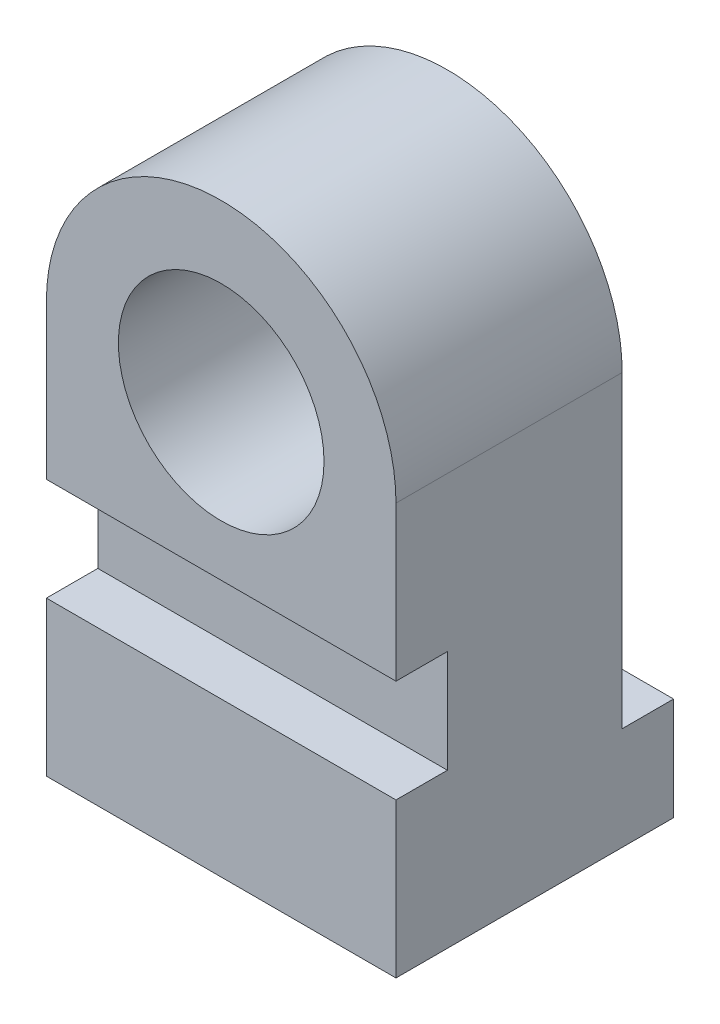
ISO-10303-21;
HEADER;
FILE_DESCRIPTION(('STEP AP214'),'2;1');
FILE_NAME('part.step','',(''),(''),'','','');
FILE_SCHEMA(('AUTOMOTIVE_DESIGN { 1 0 10303 214 1 1 1 1 }'));
ENDSEC;
DATA;
#1=APPLICATION_CONTEXT('core data for automotive mechanical design processes');
#2=APPLICATION_PROTOCOL_DEFINITION('international standard','automotive_design',2000,#1);
#3=PRODUCT_CONTEXT('',#1,'mechanical');
#4=PRODUCT('Part','Part','',(#3));
#5=PRODUCT_RELATED_PRODUCT_CATEGORY('part','',(#4));
#6=PRODUCT_DEFINITION_FORMATION('','',#4);
#7=PRODUCT_DEFINITION_CONTEXT('part definition',#1,'design');
#8=PRODUCT_DEFINITION('design','',#6,#7);
#9=PRODUCT_DEFINITION_SHAPE('','',#8);
#10=(LENGTH_UNIT() NAMED_UNIT(*) SI_UNIT(.MILLI.,.METRE.));
#11=(NAMED_UNIT(*) PLANE_ANGLE_UNIT() SI_UNIT($,.RADIAN.));
#12=(NAMED_UNIT(*) SI_UNIT($,.STERADIAN.) SOLID_ANGLE_UNIT());
#13=UNCERTAINTY_MEASURE_WITH_UNIT(LENGTH_MEASURE(1.E-05),#10,'distance_accuracy_value','');
#14=(GEOMETRIC_REPRESENTATION_CONTEXT(3) GLOBAL_UNCERTAINTY_ASSIGNED_CONTEXT((#13)) GLOBAL_UNIT_ASSIGNED_CONTEXT((#10,
#11,#12)) REPRESENTATION_CONTEXT('',''));
#15=CARTESIAN_POINT('',(0.,0.,0.));
#16=DIRECTION('',(0.,0.,1.));
#17=DIRECTION('',(1.,0.,0.));
#18=AXIS2_PLACEMENT_3D('',#15,#16,#17);
#19=CARTESIAN_POINT('',(0.,40000.,0.));
#20=DIRECTION('',(0.,0.,1.));
#21=DIRECTION('',(1.,0.,0.));
#22=AXIS2_PLACEMENT_3D('',#19,#20,#21);
#23=PLANE('',#22);
#24=CARTESIAN_POINT('',(0.,40000.,0.));
#25=DIRECTION('',(0.,0.,1.));
#26=DIRECTION('',(1.,0.,0.));
#27=AXIS2_PLACEMENT_3D('',#24,#25,#26);
#28=CIRCLE('',#27,10000.);
#29=CARTESIAN_POINT('',(10000.,40000.,0.));
#30=VERTEX_POINT('',#29);
#31=EDGE_CURVE('E160',#30,#30,#28,.T.);
#32=ORIENTED_EDGE('',*,*,#31,.T.);
#33=EDGE_LOOP('',(#32));
#34=FACE_BOUND('',#33,.T.);
#35=DIRECTION('',(1.,0.,0.));
#36=VECTOR('',#35,1.);
#37=CARTESIAN_POINT('',(17000.,10000.,0.));
#38=LINE('',#37,#36);
#39=CARTESIAN_POINT('',(-17000.,10000.,0.));
#40=VERTEX_POINT('',#39);
#41=CARTESIAN_POINT('',(17000.,10000.,0.));
#42=VERTEX_POINT('',#41);
#43=EDGE_CURVE('E47',#40,#42,#38,.T.);
#44=ORIENTED_EDGE('',*,*,#43,.F.);
#45=DIRECTION('',(0.,-1.,0.));
#46=VECTOR('',#45,1.);
#47=CARTESIAN_POINT('',(-17000.,40000.,0.));
#48=LINE('',#47,#46);
#49=CARTESIAN_POINT('',(-17000.,40000.,0.));
#50=VERTEX_POINT('',#49);
#51=EDGE_CURVE('E169',#50,#40,#48,.T.);
#52=ORIENTED_EDGE('',*,*,#51,.F.);
#53=CARTESIAN_POINT('',(0.,40000.,0.));
#54=DIRECTION('',(0.,0.,1.));
#55=DIRECTION('',(1.,0.,0.));
#56=AXIS2_PLACEMENT_3D('',#53,#54,#55);
#57=CIRCLE('',#56,17000.);
#58=CARTESIAN_POINT('',(17000.,40000.,0.));
#59=VERTEX_POINT('',#58);
#60=EDGE_CURVE('E186',#59,#50,#57,.T.);
#61=ORIENTED_EDGE('',*,*,#60,.F.);
#62=DIRECTION('',(0.,1.,0.));
#63=VECTOR('',#62,1.);
#64=CARTESIAN_POINT('',(17000.,40000.,0.));
#65=LINE('',#64,#63);
#66=EDGE_CURVE('E184',#42,#59,#65,.T.);
#67=ORIENTED_EDGE('',*,*,#66,.F.);
#68=EDGE_LOOP('',(#44,#52,#61,#67));
#69=FACE_BOUND('',#68,.T.);
#70=ADVANCED_FACE('F32',(#34,#69),#23,.F.);
#71=CARTESIAN_POINT('',(0.,40000.,22000.));
#72=DIRECTION('',(0.,0.,1.));
#73=DIRECTION('',(1.,0.,0.));
#74=AXIS2_PLACEMENT_3D('',#71,#72,#73);
#75=PLANE('',#74);
#76=DIRECTION('',(-1.,0.,0.));
#77=VECTOR('',#76,1.);
#78=CARTESIAN_POINT('',(-17000.,25000.,22000.));
#79=LINE('',#78,#77);
#80=CARTESIAN_POINT('',(17000.,25000.,22000.));
#81=VERTEX_POINT('',#80);
#82=CARTESIAN_POINT('',(-17000.,25000.,22000.));
#83=VERTEX_POINT('',#82);
#84=EDGE_CURVE('E147',#81,#83,#79,.T.);
#85=ORIENTED_EDGE('',*,*,#84,.F.);
#86=DIRECTION('',(0.,1.,0.));
#87=VECTOR('',#86,1.);
#88=CARTESIAN_POINT('',(17000.,40000.,22000.));
#89=LINE('',#88,#87);
#90=CARTESIAN_POINT('',(17000.,40000.,22000.));
#91=VERTEX_POINT('',#90);
#92=EDGE_CURVE('E178',#81,#91,#89,.T.);
#93=ORIENTED_EDGE('',*,*,#92,.T.);
#94=CARTESIAN_POINT('',(0.,40000.,22000.));
#95=DIRECTION('',(0.,0.,1.));
#96=DIRECTION('',(1.,0.,0.));
#97=AXIS2_PLACEMENT_3D('',#94,#95,#96);
#98=CIRCLE('',#97,17000.);
#99=CARTESIAN_POINT('',(-17000.,40000.,22000.));
#100=VERTEX_POINT('',#99);
#101=EDGE_CURVE('E180',#91,#100,#98,.T.);
#102=ORIENTED_EDGE('',*,*,#101,.T.);
#103=DIRECTION('',(0.,-1.,0.));
#104=VECTOR('',#103,1.);
#105=CARTESIAN_POINT('',(-17000.,40000.,22000.));
#106=LINE('',#105,#104);
#107=EDGE_CURVE('E172',#100,#83,#106,.T.);
#108=ORIENTED_EDGE('',*,*,#107,.T.);
#109=EDGE_LOOP('',(#85,#93,#102,#108));
#110=FACE_BOUND('',#109,.T.);
#111=CARTESIAN_POINT('',(0.,40000.,22000.));
#112=DIRECTION('',(0.,0.,1.));
#113=DIRECTION('',(1.,0.,0.));
#114=AXIS2_PLACEMENT_3D('',#111,#112,#113);
#115=CIRCLE('',#114,10000.);
#116=CARTESIAN_POINT('',(10000.,40000.,22000.));
#117=VERTEX_POINT('',#116);
#118=EDGE_CURVE('E166',#117,#117,#115,.T.);
#119=ORIENTED_EDGE('',*,*,#118,.F.);
#120=EDGE_LOOP('',(#119));
#121=FACE_BOUND('',#120,.T.);
#122=ADVANCED_FACE('F214',(#110,#121),#75,.T.);
#123=DIRECTION('',(1.,0.,0.));
#124=VECTOR('',#123,1.);
#125=CARTESIAN_POINT('',(-17000.,15000.,22000.));
#126=LINE('',#125,#124);
#127=CARTESIAN_POINT('',(-17000.,15000.,22000.));
#128=VERTEX_POINT('',#127);
#129=CARTESIAN_POINT('',(17000.,15000.,22000.));
#130=VERTEX_POINT('',#129);
#131=EDGE_CURVE('E144',#128,#130,#126,.T.);
#132=ORIENTED_EDGE('',*,*,#131,.F.);
#133=CARTESIAN_POINT('',(-17000.,0.,22000.));
#134=VERTEX_POINT('',#133);
#135=EDGE_CURVE('E176',#128,#134,#106,.T.);
#136=ORIENTED_EDGE('',*,*,#135,.T.);
#137=DIRECTION('',(1.,0.,0.));
#138=VECTOR('',#137,1.);
#139=CARTESIAN_POINT('',(-17000.,0.,22000.));
#140=LINE('',#139,#138);
#141=CARTESIAN_POINT('',(17000.,0.,22000.));
#142=VERTEX_POINT('',#141);
#143=EDGE_CURVE('E175',#134,#142,#140,.T.);
#144=ORIENTED_EDGE('',*,*,#143,.T.);
#145=EDGE_CURVE('E118',#142,#130,#89,.T.);
#146=ORIENTED_EDGE('',*,*,#145,.T.);
#147=EDGE_LOOP('',(#132,#136,#144,#146));
#148=FACE_BOUND('',#147,.T.);
#149=ADVANCED_FACE('F220',(#148),#75,.T.);
#150=CARTESIAN_POINT('',(-17000.,40000.,22000.));
#151=DIRECTION('',(1.,0.,0.));
#152=DIRECTION('',(0.,0.,-1.));
#153=AXIS2_PLACEMENT_3D('',#150,#151,#152);
#154=PLANE('',#153);
#155=DIRECTION('',(0.,-1.,0.));
#156=VECTOR('',#155,1.);
#157=CARTESIAN_POINT('',(-17000.,15000.,17000.));
#158=LINE('',#157,#156);
#159=CARTESIAN_POINT('',(-17000.,25000.,17000.));
#160=VERTEX_POINT('',#159);
#161=CARTESIAN_POINT('',(-17000.,15000.,17000.));
#162=VERTEX_POINT('',#161);
#163=EDGE_CURVE('E145',#160,#162,#158,.T.);
#164=ORIENTED_EDGE('',*,*,#163,.F.);
#165=DIRECTION('',(0.,0.,1.));
#166=VECTOR('',#165,1.);
#167=CARTESIAN_POINT('',(-17000.,25000.,17000.));
#168=LINE('',#167,#166);
#169=EDGE_CURVE('E157',#160,#83,#168,.T.);
#170=ORIENTED_EDGE('',*,*,#169,.T.);
#171=ORIENTED_EDGE('',*,*,#107,.F.);
#172=DIRECTION('',(0.,0.,-1.));
#173=VECTOR('',#172,1.);
#174=CARTESIAN_POINT('',(-17000.,40000.,22000.));
#175=LINE('',#174,#173);
#176=EDGE_CURVE('E182',#100,#50,#175,.T.);
#177=ORIENTED_EDGE('',*,*,#176,.T.);
#178=ORIENTED_EDGE('',*,*,#51,.T.);
#179=DIRECTION('',(0.,0.,1.));
#180=VECTOR('',#179,1.);
#181=CARTESIAN_POINT('',(-17000.,10000.,-5000.));
#182=LINE('',#181,#180);
#183=CARTESIAN_POINT('',(-17000.,10000.,-5000.));
#184=VERTEX_POINT('',#183);
#185=EDGE_CURVE('E141',#184,#40,#182,.T.);
#186=ORIENTED_EDGE('',*,*,#185,.F.);
#187=DIRECTION('',(0.,1.,0.));
#188=VECTOR('',#187,1.);
#189=CARTESIAN_POINT('',(-17000.,0.,-5000.));
#190=LINE('',#189,#188);
#191=CARTESIAN_POINT('',(-17000.,0.,-5000.));
#192=VERTEX_POINT('',#191);
#193=EDGE_CURVE('E128',#192,#184,#190,.T.);
#194=ORIENTED_EDGE('',*,*,#193,.F.);
#195=DIRECTION('',(0.,0.,-1.));
#196=VECTOR('',#195,1.);
#197=CARTESIAN_POINT('',(-17000.,0.,22000.));
#198=LINE('',#197,#196);
#199=EDGE_CURVE('E11',#134,#192,#198,.T.);
#200=ORIENTED_EDGE('',*,*,#199,.F.);
#201=ORIENTED_EDGE('',*,*,#135,.F.);
#202=DIRECTION('',(0.,0.,1.));
#203=VECTOR('',#202,1.);
#204=CARTESIAN_POINT('',(-17000.,15000.,17000.));
#205=LINE('',#204,#203);
#206=EDGE_CURVE('E154',#162,#128,#205,.T.);
#207=ORIENTED_EDGE('',*,*,#206,.F.);
#208=EDGE_LOOP('',(#164,#170,#171,#177,#178,#186,#194,#200,#201,#207));
#209=FACE_BOUND('',#208,.T.);
#210=ADVANCED_FACE('F34',(#209),#154,.F.);
#211=CARTESIAN_POINT('',(-17000.,0.,22000.));
#212=DIRECTION('',(0.,1.,0.));
#213=DIRECTION('',(0.,0.,1.));
#214=AXIS2_PLACEMENT_3D('',#211,#212,#213);
#215=PLANE('',#214);
#216=ORIENTED_EDGE('',*,*,#199,.T.);
#217=DIRECTION('',(-1.,0.,0.));
#218=VECTOR('',#217,1.);
#219=CARTESIAN_POINT('',(17000.,0.,-5000.));
#220=LINE('',#219,#218);
#221=CARTESIAN_POINT('',(17000.,0.,-5000.));
#222=VERTEX_POINT('',#221);
#223=EDGE_CURVE('E123',#222,#192,#220,.T.);
#224=ORIENTED_EDGE('',*,*,#223,.F.);
#225=DIRECTION('',(0.,0.,-1.));
#226=VECTOR('',#225,1.);
#227=CARTESIAN_POINT('',(17000.,0.,22000.));
#228=LINE('',#227,#226);
#229=EDGE_CURVE('E40',#142,#222,#228,.T.);
#230=ORIENTED_EDGE('',*,*,#229,.F.);
#231=ORIENTED_EDGE('',*,*,#143,.F.);
#232=EDGE_LOOP('',(#216,#224,#230,#231));
#233=FACE_BOUND('',#232,.T.);
#234=ADVANCED_FACE('F124',(#233),#215,.F.);
#235=CARTESIAN_POINT('',(17000.,40000.,22000.));
#236=DIRECTION('',(-1.,0.,0.));
#237=DIRECTION('',(0.,0.,1.));
#238=AXIS2_PLACEMENT_3D('',#235,#236,#237);
#239=PLANE('',#238);
#240=ORIENTED_EDGE('',*,*,#92,.F.);
#241=DIRECTION('',(0.,0.,1.));
#242=VECTOR('',#241,1.);
#243=CARTESIAN_POINT('',(17000.,25000.,17000.));
#244=LINE('',#243,#242);
#245=CARTESIAN_POINT('',(17000.,25000.,17000.));
#246=VERTEX_POINT('',#245);
#247=EDGE_CURVE('E161',#246,#81,#244,.T.);
#248=ORIENTED_EDGE('',*,*,#247,.F.);
#249=DIRECTION('',(0.,1.,0.));
#250=VECTOR('',#249,1.);
#251=CARTESIAN_POINT('',(17000.,15000.,17000.));
#252=LINE('',#251,#250);
#253=CARTESIAN_POINT('',(17000.,15000.,17000.));
#254=VERTEX_POINT('',#253);
#255=EDGE_CURVE('E149',#254,#246,#252,.T.);
#256=ORIENTED_EDGE('',*,*,#255,.F.);
#257=DIRECTION('',(0.,0.,1.));
#258=VECTOR('',#257,1.);
#259=CARTESIAN_POINT('',(17000.,15000.,17000.));
#260=LINE('',#259,#258);
#261=EDGE_CURVE('E163',#254,#130,#260,.T.);
#262=ORIENTED_EDGE('',*,*,#261,.T.);
#263=ORIENTED_EDGE('',*,*,#145,.F.);
#264=ORIENTED_EDGE('',*,*,#229,.T.);
#265=DIRECTION('',(0.,-1.,0.));
#266=VECTOR('',#265,1.);
#267=CARTESIAN_POINT('',(17000.,0.,-5000.));
#268=LINE('',#267,#266);
#269=CARTESIAN_POINT('',(17000.,10000.,-5000.));
#270=VERTEX_POINT('',#269);
#271=EDGE_CURVE('E115',#270,#222,#268,.T.);
#272=ORIENTED_EDGE('',*,*,#271,.F.);
#273=DIRECTION('',(0.,0.,1.));
#274=VECTOR('',#273,1.);
#275=CARTESIAN_POINT('',(17000.,10000.,-5000.));
#276=LINE('',#275,#274);
#277=EDGE_CURVE('E138',#270,#42,#276,.T.);
#278=ORIENTED_EDGE('',*,*,#277,.T.);
#279=ORIENTED_EDGE('',*,*,#66,.T.);
#280=DIRECTION('',(0.,0.,-1.));
#281=VECTOR('',#280,1.);
#282=CARTESIAN_POINT('',(17000.,40000.,22000.));
#283=LINE('',#282,#281);
#284=EDGE_CURVE('E121',#91,#59,#283,.T.);
#285=ORIENTED_EDGE('',*,*,#284,.F.);
#286=EDGE_LOOP('',(#240,#248,#256,#262,#263,#264,#272,#278,#279,#285));
#287=FACE_BOUND('',#286,.T.);
#288=ADVANCED_FACE('F112',(#287),#239,.F.);
#289=CARTESIAN_POINT('',(0.,40000.,22000.));
#290=DIRECTION('',(0.,0.,-1.));
#291=DIRECTION('',(-1.,0.,0.));
#292=AXIS2_PLACEMENT_3D('',#289,#290,#291);
#293=CYLINDRICAL_SURFACE('',#292,17000.);
#294=ORIENTED_EDGE('',*,*,#60,.T.);
#295=ORIENTED_EDGE('',*,*,#176,.F.);
#296=ORIENTED_EDGE('',*,*,#101,.F.);
#297=ORIENTED_EDGE('',*,*,#284,.T.);
#298=EDGE_LOOP('',(#294,#295,#296,#297));
#299=FACE_BOUND('',#298,.T.);
#300=ADVANCED_FACE('F195',(#299),#293,.T.);
#301=CARTESIAN_POINT('',(0.,40000.,22000.));
#302=DIRECTION('',(0.,0.,-1.));
#303=DIRECTION('',(-1.,0.,0.));
#304=AXIS2_PLACEMENT_3D('',#301,#302,#303);
#305=CYLINDRICAL_SURFACE('',#304,10000.);
#306=ORIENTED_EDGE('',*,*,#118,.T.);
#307=EDGE_LOOP('',(#306));
#308=FACE_BOUND('',#307,.T.);
#309=ORIENTED_EDGE('',*,*,#31,.F.);
#310=EDGE_LOOP('',(#309));
#311=FACE_BOUND('',#310,.T.);
#312=ADVANCED_FACE('F227',(#308,#311),#305,.F.);
#313=CARTESIAN_POINT('',(-17000.,25000.,17000.));
#314=DIRECTION('',(0.,1.,0.));
#315=DIRECTION('',(0.,0.,1.));
#316=AXIS2_PLACEMENT_3D('',#313,#314,#315);
#317=PLANE('',#316);
#318=ORIENTED_EDGE('',*,*,#84,.T.);
#319=ORIENTED_EDGE('',*,*,#169,.F.);
#320=DIRECTION('',(-1.,0.,0.));
#321=VECTOR('',#320,1.);
#322=CARTESIAN_POINT('',(-17000.,25000.,17000.));
#323=LINE('',#322,#321);
#324=EDGE_CURVE('E151',#246,#160,#323,.T.);
#325=ORIENTED_EDGE('',*,*,#324,.F.);
#326=ORIENTED_EDGE('',*,*,#247,.T.);
#327=EDGE_LOOP('',(#318,#319,#325,#326));
#328=FACE_BOUND('',#327,.T.);
#329=ADVANCED_FACE('F247',(#328),#317,.F.);
#330=CARTESIAN_POINT('',(-17000.,15000.,17000.));
#331=DIRECTION('',(0.,-1.,0.));
#332=DIRECTION('',(0.,0.,-1.));
#333=AXIS2_PLACEMENT_3D('',#330,#331,#332);
#334=PLANE('',#333);
#335=ORIENTED_EDGE('',*,*,#131,.T.);
#336=ORIENTED_EDGE('',*,*,#261,.F.);
#337=DIRECTION('',(1.,0.,0.));
#338=VECTOR('',#337,1.);
#339=CARTESIAN_POINT('',(-17000.,15000.,17000.));
#340=LINE('',#339,#338);
#341=EDGE_CURVE('E55',#162,#254,#340,.T.);
#342=ORIENTED_EDGE('',*,*,#341,.F.);
#343=ORIENTED_EDGE('',*,*,#206,.T.);
#344=EDGE_LOOP('',(#335,#336,#342,#343));
#345=FACE_BOUND('',#344,.T.);
#346=ADVANCED_FACE('F211',(#345),#334,.F.);
#347=CARTESIAN_POINT('',(0.,0.,17000.));
#348=DIRECTION('',(0.,0.,-1.));
#349=DIRECTION('',(-1.,0.,0.));
#350=AXIS2_PLACEMENT_3D('',#347,#348,#349);
#351=PLANE('',#350);
#352=ORIENTED_EDGE('',*,*,#163,.T.);
#353=ORIENTED_EDGE('',*,*,#341,.T.);
#354=ORIENTED_EDGE('',*,*,#255,.T.);
#355=ORIENTED_EDGE('',*,*,#324,.T.);
#356=EDGE_LOOP('',(#352,#353,#354,#355));
#357=FACE_BOUND('',#356,.T.);
#358=ADVANCED_FACE('F204',(#357),#351,.F.);
#359=CARTESIAN_POINT('',(17000.,10000.,-5000.));
#360=DIRECTION('',(0.,-1.,0.));
#361=DIRECTION('',(0.,0.,-1.));
#362=AXIS2_PLACEMENT_3D('',#359,#360,#361);
#363=PLANE('',#362);
#364=ORIENTED_EDGE('',*,*,#43,.T.);
#365=ORIENTED_EDGE('',*,*,#277,.F.);
#366=DIRECTION('',(1.,0.,0.));
#367=VECTOR('',#366,1.);
#368=CARTESIAN_POINT('',(17000.,10000.,-5000.));
#369=LINE('',#368,#367);
#370=EDGE_CURVE('E132',#184,#270,#369,.T.);
#371=ORIENTED_EDGE('',*,*,#370,.F.);
#372=ORIENTED_EDGE('',*,*,#185,.T.);
#373=EDGE_LOOP('',(#364,#365,#371,#372));
#374=FACE_BOUND('',#373,.T.);
#375=ADVANCED_FACE('F202',(#374),#363,.F.);
#376=CARTESIAN_POINT('',(0.,0.,-5000.));
#377=DIRECTION('',(0.,0.,1.));
#378=DIRECTION('',(1.,0.,0.));
#379=AXIS2_PLACEMENT_3D('',#376,#377,#378);
#380=PLANE('',#379);
#381=ORIENTED_EDGE('',*,*,#271,.T.);
#382=ORIENTED_EDGE('',*,*,#223,.T.);
#383=ORIENTED_EDGE('',*,*,#193,.T.);
#384=ORIENTED_EDGE('',*,*,#370,.T.);
#385=EDGE_LOOP('',(#381,#382,#383,#384));
#386=FACE_BOUND('',#385,.T.);
#387=ADVANCED_FACE('F130',(#386),#380,.F.);
#388=CLOSED_SHELL('',(#70,#122,#149,#210,#234,#288,#300,#312,#329,#346,#358,#375,#387));
#389=MANIFOLD_SOLID_BREP('B2',#388);
#390=ADVANCED_BREP_SHAPE_REPRESENTATION('',(#18,#389),#14);
#391=SHAPE_DEFINITION_REPRESENTATION(#9,#390);
ENDSEC;
END-ISO-10303-21;
